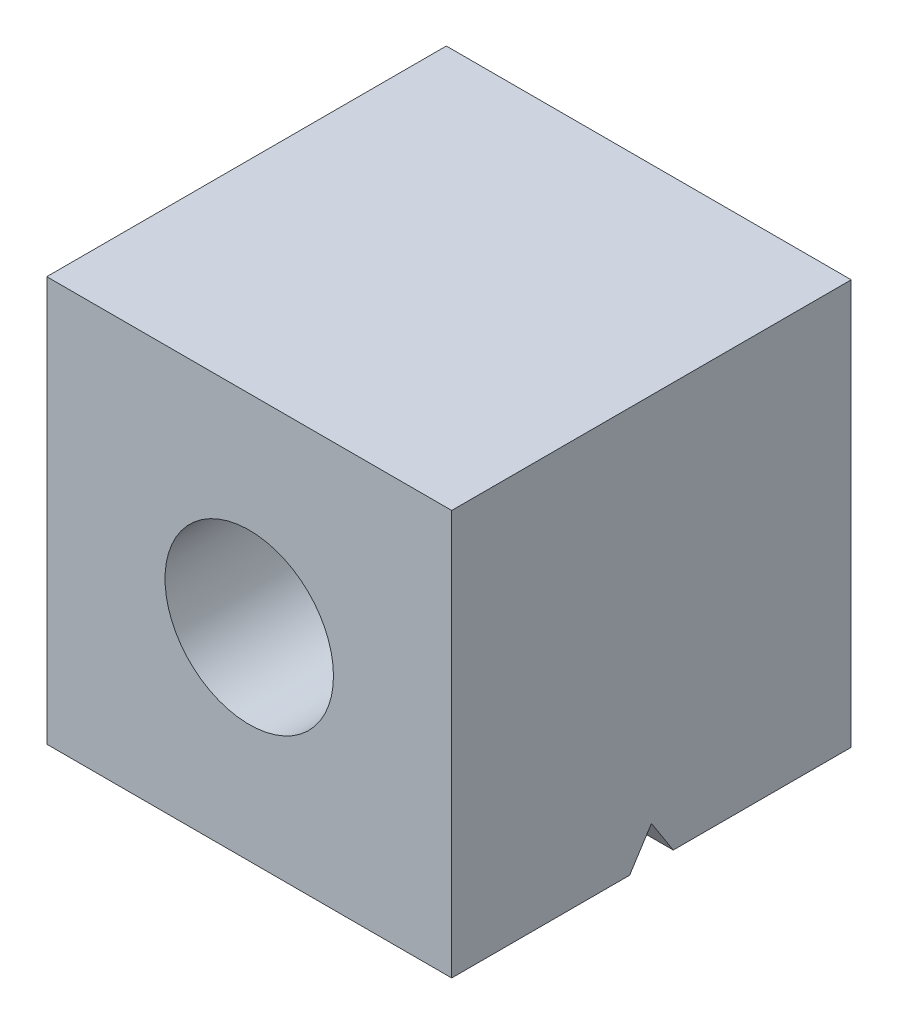
ISO-10303-21;
HEADER;
FILE_DESCRIPTION(('STEP AP214'),'2;1');
FILE_NAME('part.step','',(''),(''),'','','');
FILE_SCHEMA(('AUTOMOTIVE_DESIGN { 1 0 10303 214 1 1 1 1 }'));
ENDSEC;
DATA;
#1=APPLICATION_CONTEXT('core data for automotive mechanical design processes');
#2=APPLICATION_PROTOCOL_DEFINITION('international standard','automotive_design',2000,#1);
#3=PRODUCT_CONTEXT('',#1,'mechanical');
#4=PRODUCT('Part','Part','',(#3));
#5=PRODUCT_RELATED_PRODUCT_CATEGORY('part','',(#4));
#6=PRODUCT_DEFINITION_FORMATION('','',#4);
#7=PRODUCT_DEFINITION_CONTEXT('part definition',#1,'design');
#8=PRODUCT_DEFINITION('design','',#6,#7);
#9=PRODUCT_DEFINITION_SHAPE('','',#8);
#10=(LENGTH_UNIT() NAMED_UNIT(*) SI_UNIT(.MILLI.,.METRE.));
#11=(NAMED_UNIT(*) PLANE_ANGLE_UNIT() SI_UNIT($,.RADIAN.));
#12=(NAMED_UNIT(*) SI_UNIT($,.STERADIAN.) SOLID_ANGLE_UNIT());
#13=UNCERTAINTY_MEASURE_WITH_UNIT(LENGTH_MEASURE(1.E-05),#10,'distance_accuracy_value','');
#14=(GEOMETRIC_REPRESENTATION_CONTEXT(3) GLOBAL_UNCERTAINTY_ASSIGNED_CONTEXT((#13)) GLOBAL_UNIT_ASSIGNED_CONTEXT((#10,
#11,#12)) REPRESENTATION_CONTEXT('',''));
#15=CARTESIAN_POINT('',(0.,0.,0.));
#16=DIRECTION('',(0.,0.,1.));
#17=DIRECTION('',(1.,0.,0.));
#18=AXIS2_PLACEMENT_3D('',#15,#16,#17);
#19=CARTESIAN_POINT('',(-9.525,-9.525,18.796));
#20=DIRECTION('',(0.,1.,0.));
#21=DIRECTION('',(0.,0.,1.));
#22=AXIS2_PLACEMENT_3D('',#19,#20,#21);
#23=PLANE('',#22);
#24=DIRECTION('',(-1.,0.,0.));
#25=VECTOR('',#24,1.);
#26=CARTESIAN_POINT('',(52.9682194790691,-9.525,10.4245118638513));
#27=LINE('',#26,#25);
#28=CARTESIAN_POINT('',(9.525,-9.525,10.4245118638513));
#29=VERTEX_POINT('',#28);
#30=CARTESIAN_POINT('',(-9.525,-9.525,10.4245118638513));
#31=VERTEX_POINT('',#30);
#32=EDGE_CURVE('E176',#29,#31,#27,.T.);
#33=ORIENTED_EDGE('',*,*,#32,.F.);
#34=DIRECTION('',(0.,0.,-1.));
#35=VECTOR('',#34,1.);
#36=CARTESIAN_POINT('',(9.525,-9.525,18.796));
#37=LINE('',#36,#35);
#38=CARTESIAN_POINT('',(9.525,-9.525,18.796));
#39=VERTEX_POINT('',#38);
#40=EDGE_CURVE('E113',#39,#29,#37,.T.);
#41=ORIENTED_EDGE('',*,*,#40,.F.);
#42=DIRECTION('',(1.,0.,0.));
#43=VECTOR('',#42,1.);
#44=CARTESIAN_POINT('',(-9.525,-9.525,18.796));
#45=LINE('',#44,#43);
#46=CARTESIAN_POINT('',(-9.525,-9.525,18.796));
#47=VERTEX_POINT('',#46);
#48=EDGE_CURVE('E153',#47,#39,#45,.T.);
#49=ORIENTED_EDGE('',*,*,#48,.F.);
#50=DIRECTION('',(0.,0.,-1.));
#51=VECTOR('',#50,1.);
#52=CARTESIAN_POINT('',(-9.525,-9.525,18.796));
#53=LINE('',#52,#51);
#54=EDGE_CURVE('E112',#47,#31,#53,.T.);
#55=ORIENTED_EDGE('',*,*,#54,.T.);
#56=EDGE_LOOP('',(#33,#41,#49,#55));
#57=FACE_BOUND('',#56,.T.);
#58=ADVANCED_FACE('F43',(#57),#23,.F.);
#59=CARTESIAN_POINT('',(9.525,9.525,18.796));
#60=DIRECTION('',(-1.,0.,0.));
#61=DIRECTION('',(0.,-1.,0.));
#62=AXIS2_PLACEMENT_3D('',#59,#60,#61);
#63=PLANE('',#62);
#64=DIRECTION('',(0.,-0.841701620114982,0.539942943926314));
#65=VECTOR('',#64,1.);
#66=CARTESIAN_POINT('',(9.525,0.166596475015076,4.20745227051147));
#67=LINE('',#66,#65);
#68=CARTESIAN_POINT('',(9.525,-7.9248,9.398));
#69=VERTEX_POINT('',#68);
#70=EDGE_CURVE('E59',#69,#29,#67,.T.);
#71=ORIENTED_EDGE('',*,*,#70,.F.);
#72=DIRECTION('',(0.,0.841701620114982,0.539942943926314));
#73=VECTOR('',#72,1.);
#74=CARTESIAN_POINT('',(9.525,8.70883058425409,20.0683031706391));
#75=LINE('',#74,#73);
#76=CARTESIAN_POINT('',(9.525,-9.525,8.3714881361487));
#77=VERTEX_POINT('',#76);
#78=EDGE_CURVE('E63',#77,#69,#75,.T.);
#79=ORIENTED_EDGE('',*,*,#78,.F.);
#80=CARTESIAN_POINT('',(9.525,-9.525,0.));
#81=VERTEX_POINT('',#80);
#82=EDGE_CURVE('E118',#77,#81,#37,.T.);
#83=ORIENTED_EDGE('',*,*,#82,.T.);
#84=DIRECTION('',(0.,1.,0.));
#85=VECTOR('',#84,1.);
#86=CARTESIAN_POINT('',(9.525,9.525,0.));
#87=LINE('',#86,#85);
#88=CARTESIAN_POINT('',(9.525,9.525,0.));
#89=VERTEX_POINT('',#88);
#90=EDGE_CURVE('E148',#81,#89,#87,.T.);
#91=ORIENTED_EDGE('',*,*,#90,.T.);
#92=DIRECTION('',(0.,0.,-1.));
#93=VECTOR('',#92,1.);
#94=CARTESIAN_POINT('',(9.525,9.525,18.796));
#95=LINE('',#94,#93);
#96=CARTESIAN_POINT('',(9.525,9.525,18.796));
#97=VERTEX_POINT('',#96);
#98=EDGE_CURVE('E127',#97,#89,#95,.T.);
#99=ORIENTED_EDGE('',*,*,#98,.F.);
#100=DIRECTION('',(0.,1.,0.));
#101=VECTOR('',#100,1.);
#102=CARTESIAN_POINT('',(9.525,9.525,18.796));
#103=LINE('',#102,#101);
#104=EDGE_CURVE('E142',#39,#97,#103,.T.);
#105=ORIENTED_EDGE('',*,*,#104,.F.);
#106=ORIENTED_EDGE('',*,*,#40,.T.);
#107=EDGE_LOOP('',(#71,#79,#83,#91,#99,#105,#106));
#108=FACE_BOUND('',#107,.T.);
#109=ADVANCED_FACE('F45',(#108),#63,.F.);
#110=CARTESIAN_POINT('',(-9.525,9.525,18.796));
#111=DIRECTION('',(1.,0.,0.));
#112=DIRECTION('',(0.,0.,-1.));
#113=AXIS2_PLACEMENT_3D('',#110,#111,#112);
#114=PLANE('',#113);
#115=DIRECTION('',(0.,0.841701620114982,-0.539942943926314));
#116=VECTOR('',#115,1.);
#117=CARTESIAN_POINT('',(-9.525,0.166596475015076,4.20745227051147));
#118=LINE('',#117,#116);
#119=CARTESIAN_POINT('',(-9.525,-7.9248,9.398));
#120=VERTEX_POINT('',#119);
#121=EDGE_CURVE('E11',#31,#120,#118,.T.);
#122=ORIENTED_EDGE('',*,*,#121,.F.);
#123=ORIENTED_EDGE('',*,*,#54,.F.);
#124=DIRECTION('',(0.,-1.,0.));
#125=VECTOR('',#124,1.);
#126=CARTESIAN_POINT('',(-9.525,9.525,18.796));
#127=LINE('',#126,#125);
#128=CARTESIAN_POINT('',(-9.525,9.525,18.796));
#129=VERTEX_POINT('',#128);
#130=EDGE_CURVE('E156',#129,#47,#127,.T.);
#131=ORIENTED_EDGE('',*,*,#130,.F.);
#132=DIRECTION('',(0.,0.,-1.));
#133=VECTOR('',#132,1.);
#134=CARTESIAN_POINT('',(-9.525,9.525,18.796));
#135=LINE('',#134,#133);
#136=CARTESIAN_POINT('',(-9.525,9.525,0.));
#137=VERTEX_POINT('',#136);
#138=EDGE_CURVE('E130',#129,#137,#135,.T.);
#139=ORIENTED_EDGE('',*,*,#138,.T.);
#140=DIRECTION('',(0.,-1.,0.));
#141=VECTOR('',#140,1.);
#142=CARTESIAN_POINT('',(-9.525,9.525,0.));
#143=LINE('',#142,#141);
#144=CARTESIAN_POINT('',(-9.525,-9.525,0.));
#145=VERTEX_POINT('',#144);
#146=EDGE_CURVE('E107',#137,#145,#143,.T.);
#147=ORIENTED_EDGE('',*,*,#146,.T.);
#148=CARTESIAN_POINT('',(-9.525,-9.525,8.3714881361487));
#149=VERTEX_POINT('',#148);
#150=EDGE_CURVE('E101',#149,#145,#53,.T.);
#151=ORIENTED_EDGE('',*,*,#150,.F.);
#152=DIRECTION('',(0.,-0.841701620114982,-0.539942943926314));
#153=VECTOR('',#152,1.);
#154=CARTESIAN_POINT('',(-9.525,8.70883058425409,20.0683031706391));
#155=LINE('',#154,#153);
#156=EDGE_CURVE('E52',#120,#149,#155,.T.);
#157=ORIENTED_EDGE('',*,*,#156,.F.);
#158=EDGE_LOOP('',(#122,#123,#131,#139,#147,#151,#157));
#159=FACE_BOUND('',#158,.T.);
#160=ADVANCED_FACE('F103',(#159),#114,.F.);
#161=CARTESIAN_POINT('',(-9.525,9.525,18.796));
#162=DIRECTION('',(0.,-1.,0.));
#163=DIRECTION('',(0.,0.,-1.));
#164=AXIS2_PLACEMENT_3D('',#161,#162,#163);
#165=PLANE('',#164);
#166=DIRECTION('',(-1.,0.,0.));
#167=VECTOR('',#166,1.);
#168=CARTESIAN_POINT('',(-9.525,9.525,0.));
#169=LINE('',#168,#167);
#170=EDGE_CURVE('E145',#89,#137,#169,.T.);
#171=ORIENTED_EDGE('',*,*,#170,.T.);
#172=ORIENTED_EDGE('',*,*,#138,.F.);
#173=DIRECTION('',(-1.,0.,0.));
#174=VECTOR('',#173,1.);
#175=CARTESIAN_POINT('',(-9.525,9.525,18.796));
#176=LINE('',#175,#174);
#177=EDGE_CURVE('E159',#97,#129,#176,.T.);
#178=ORIENTED_EDGE('',*,*,#177,.F.);
#179=ORIENTED_EDGE('',*,*,#98,.T.);
#180=EDGE_LOOP('',(#171,#172,#178,#179));
#181=FACE_BOUND('',#180,.T.);
#182=ADVANCED_FACE('F188',(#181),#165,.F.);
#183=ORIENTED_EDGE('',*,*,#82,.F.);
#184=DIRECTION('',(-1.,0.,0.));
#185=VECTOR('',#184,1.);
#186=CARTESIAN_POINT('',(52.9682194790691,-9.525,8.3714881361487));
#187=LINE('',#186,#185);
#188=EDGE_CURVE('E116',#77,#149,#187,.T.);
#189=ORIENTED_EDGE('',*,*,#188,.T.);
#190=ORIENTED_EDGE('',*,*,#150,.T.);
#191=DIRECTION('',(1.,0.,0.));
#192=VECTOR('',#191,1.);
#193=CARTESIAN_POINT('',(-9.525,-9.525,0.));
#194=LINE('',#193,#192);
#195=EDGE_CURVE('E139',#145,#81,#194,.T.);
#196=ORIENTED_EDGE('',*,*,#195,.T.);
#197=EDGE_LOOP('',(#183,#189,#190,#196));
#198=FACE_BOUND('',#197,.T.);
#199=ADVANCED_FACE('F117',(#198),#23,.F.);
#200=CARTESIAN_POINT('',(0.,0.,18.796));
#201=DIRECTION('',(0.,0.,1.));
#202=DIRECTION('',(1.,0.,0.));
#203=AXIS2_PLACEMENT_3D('',#200,#201,#202);
#204=PLANE('',#203);
#205=CARTESIAN_POINT('',(0.,0.,18.796));
#206=DIRECTION('',(0.,0.,1.));
#207=DIRECTION('',(1.,0.,0.));
#208=AXIS2_PLACEMENT_3D('',#205,#206,#207);
#209=CIRCLE('',#208,3.9624);
#210=CARTESIAN_POINT('',(3.9624,0.,18.796));
#211=VERTEX_POINT('',#210);
#212=EDGE_CURVE('E165',#211,#211,#209,.T.);
#213=ORIENTED_EDGE('',*,*,#212,.F.);
#214=EDGE_LOOP('',(#213));
#215=FACE_BOUND('',#214,.T.);
#216=ORIENTED_EDGE('',*,*,#104,.T.);
#217=ORIENTED_EDGE('',*,*,#177,.T.);
#218=ORIENTED_EDGE('',*,*,#130,.T.);
#219=ORIENTED_EDGE('',*,*,#48,.T.);
#220=EDGE_LOOP('',(#216,#217,#218,#219));
#221=FACE_BOUND('',#220,.T.);
#222=ADVANCED_FACE('F192',(#215,#221),#204,.T.);
#223=CARTESIAN_POINT('',(0.,0.,0.));
#224=DIRECTION('',(0.,0.,1.));
#225=DIRECTION('',(1.,0.,0.));
#226=AXIS2_PLACEMENT_3D('',#223,#224,#225);
#227=PLANE('',#226);
#228=CARTESIAN_POINT('',(0.,0.,0.));
#229=DIRECTION('',(0.,0.,1.));
#230=DIRECTION('',(1.,0.,0.));
#231=AXIS2_PLACEMENT_3D('',#228,#229,#230);
#232=CIRCLE('',#231,3.9624);
#233=CARTESIAN_POINT('',(3.9624,0.,0.));
#234=VERTEX_POINT('',#233);
#235=EDGE_CURVE('E152',#234,#234,#232,.T.);
#236=ORIENTED_EDGE('',*,*,#235,.T.);
#237=EDGE_LOOP('',(#236));
#238=FACE_BOUND('',#237,.T.);
#239=ORIENTED_EDGE('',*,*,#90,.F.);
#240=ORIENTED_EDGE('',*,*,#195,.F.);
#241=ORIENTED_EDGE('',*,*,#146,.F.);
#242=ORIENTED_EDGE('',*,*,#170,.F.);
#243=EDGE_LOOP('',(#239,#240,#241,#242));
#244=FACE_BOUND('',#243,.T.);
#245=ADVANCED_FACE('F185',(#238,#244),#227,.F.);
#246=CARTESIAN_POINT('',(0.,0.,0.));
#247=DIRECTION('',(0.,0.,1.));
#248=DIRECTION('',(1.,0.,0.));
#249=AXIS2_PLACEMENT_3D('',#246,#247,#248);
#250=CYLINDRICAL_SURFACE('',#249,3.9624);
#251=ORIENTED_EDGE('',*,*,#235,.F.);
#252=EDGE_LOOP('',(#251));
#253=FACE_BOUND('',#252,.T.);
#254=ORIENTED_EDGE('',*,*,#212,.T.);
#255=EDGE_LOOP('',(#254));
#256=FACE_BOUND('',#255,.T.);
#257=ADVANCED_FACE('F200',(#253,#256),#250,.F.);
#258=CARTESIAN_POINT('',(52.9682194790691,-9.525,10.4245118638513));
#259=DIRECTION('',(0.,-0.539942943926314,-0.841701620114982));
#260=DIRECTION('',(0.,0.841701620114982,-0.539942943926314));
#261=AXIS2_PLACEMENT_3D('',#258,#259,#260);
#262=PLANE('',#261);
#263=DIRECTION('',(-1.,0.,0.));
#264=VECTOR('',#263,1.);
#265=CARTESIAN_POINT('',(52.9682194790691,-7.9248,9.398));
#266=LINE('',#265,#264);
#267=EDGE_CURVE('E121',#69,#120,#266,.T.);
#268=ORIENTED_EDGE('',*,*,#267,.F.);
#269=ORIENTED_EDGE('',*,*,#70,.T.);
#270=ORIENTED_EDGE('',*,*,#32,.T.);
#271=ORIENTED_EDGE('',*,*,#121,.T.);
#272=EDGE_LOOP('',(#268,#269,#270,#271));
#273=FACE_BOUND('',#272,.T.);
#274=ADVANCED_FACE('F198',(#273),#262,.T.);
#275=CARTESIAN_POINT('',(52.9682194790691,-9.525,8.3714881361487));
#276=DIRECTION('',(0.,-0.539942943926314,0.841701620114982));
#277=DIRECTION('',(0.,-0.841701620114982,-0.539942943926314));
#278=AXIS2_PLACEMENT_3D('',#275,#276,#277);
#279=PLANE('',#278);
#280=ORIENTED_EDGE('',*,*,#188,.F.);
#281=ORIENTED_EDGE('',*,*,#78,.T.);
#282=ORIENTED_EDGE('',*,*,#267,.T.);
#283=ORIENTED_EDGE('',*,*,#156,.T.);
#284=EDGE_LOOP('',(#280,#281,#282,#283));
#285=FACE_BOUND('',#284,.T.);
#286=ADVANCED_FACE('F124',(#285),#279,.T.);
#287=CLOSED_SHELL('',(#58,#109,#160,#182,#199,#222,#245,#257,#274,#286));
#288=MANIFOLD_SOLID_BREP('B2',#287);
#289=ADVANCED_BREP_SHAPE_REPRESENTATION('',(#18,#288),#14);
#290=SHAPE_DEFINITION_REPRESENTATION(#9,#289);
ENDSEC;
END-ISO-10303-21;
